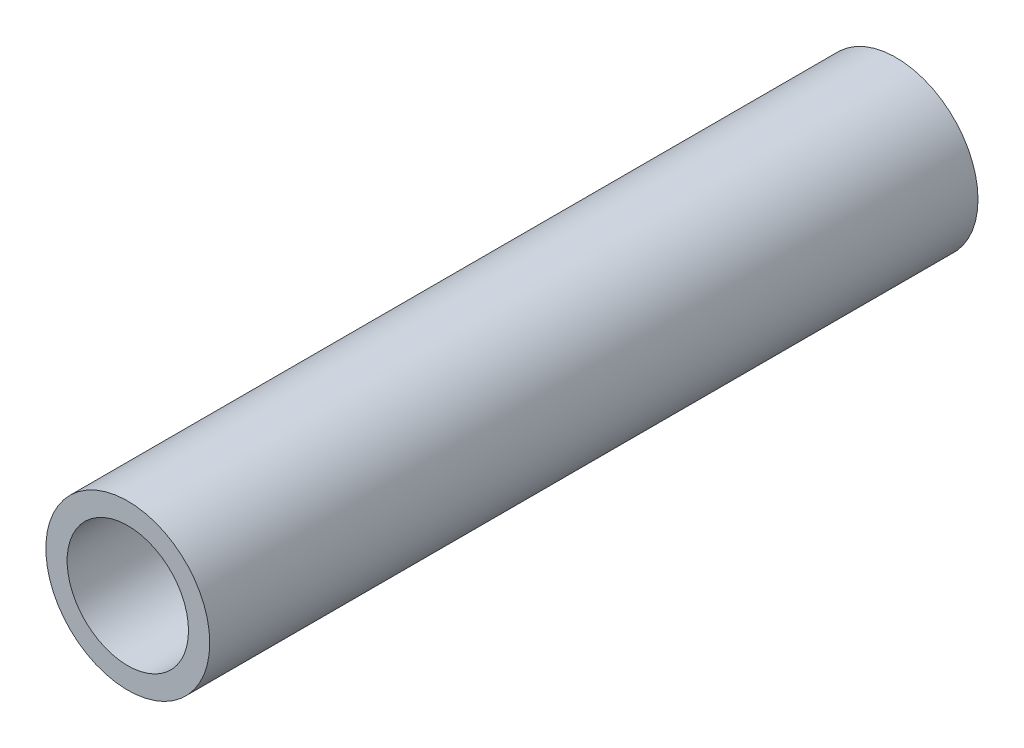
ISO-10303-21;
HEADER;
FILE_DESCRIPTION(('STEP AP214'),'2;1');
FILE_NAME('part.step','',(''),(''),'','','');
FILE_SCHEMA(('AUTOMOTIVE_DESIGN { 1 0 10303 214 1 1 1 1 }'));
ENDSEC;
DATA;
#1=APPLICATION_CONTEXT('core data for automotive mechanical design processes');
#2=APPLICATION_PROTOCOL_DEFINITION('international standard','automotive_design',2000,#1);
#3=PRODUCT_CONTEXT('',#1,'mechanical');
#4=PRODUCT('Part','Part','',(#3));
#5=PRODUCT_RELATED_PRODUCT_CATEGORY('part','',(#4));
#6=PRODUCT_DEFINITION_FORMATION('','',#4);
#7=PRODUCT_DEFINITION_CONTEXT('part definition',#1,'design');
#8=PRODUCT_DEFINITION('design','',#6,#7);
#9=PRODUCT_DEFINITION_SHAPE('','',#8);
#10=(LENGTH_UNIT() NAMED_UNIT(*) SI_UNIT(.MILLI.,.METRE.));
#11=(NAMED_UNIT(*) PLANE_ANGLE_UNIT() SI_UNIT($,.RADIAN.));
#12=(NAMED_UNIT(*) SI_UNIT($,.STERADIAN.) SOLID_ANGLE_UNIT());
#13=UNCERTAINTY_MEASURE_WITH_UNIT(LENGTH_MEASURE(1.E-05),#10,'distance_accuracy_value','');
#14=(GEOMETRIC_REPRESENTATION_CONTEXT(3) GLOBAL_UNCERTAINTY_ASSIGNED_CONTEXT((#13)) GLOBAL_UNIT_ASSIGNED_CONTEXT((#10,
#11,#12)) REPRESENTATION_CONTEXT('',''));
#15=CARTESIAN_POINT('',(0.,0.,0.));
#16=DIRECTION('',(0.,0.,1.));
#17=DIRECTION('',(1.,0.,0.));
#18=AXIS2_PLACEMENT_3D('',#15,#16,#17);
#19=CARTESIAN_POINT('',(0.,0.,50.));
#20=DIRECTION('',(0.,0.,1.));
#21=DIRECTION('',(1.,0.,0.));
#22=AXIS2_PLACEMENT_3D('',#19,#20,#21);
#23=PLANE('',#22);
#24=CARTESIAN_POINT('',(0.,0.,50.));
#25=DIRECTION('',(0.,0.,1.));
#26=DIRECTION('',(1.,0.,0.));
#27=AXIS2_PLACEMENT_3D('',#24,#25,#26);
#28=CIRCLE('',#27,10.668);
#29=CARTESIAN_POINT('',(10.668,0.,50.));
#30=VERTEX_POINT('',#29);
#31=EDGE_CURVE('E11',#30,#30,#28,.T.);
#32=ORIENTED_EDGE('',*,*,#31,.T.);
#33=EDGE_LOOP('',(#32));
#34=FACE_BOUND('',#33,.T.);
#35=CARTESIAN_POINT('',(0.,0.,50.));
#36=DIRECTION('',(0.,0.,1.));
#37=DIRECTION('',(1.,0.,0.));
#38=AXIS2_PLACEMENT_3D('',#35,#36,#37);
#39=CIRCLE('',#38,7.8994);
#40=CARTESIAN_POINT('',(7.8994,0.,50.));
#41=VERTEX_POINT('',#40);
#42=EDGE_CURVE('E56',#41,#41,#39,.T.);
#43=ORIENTED_EDGE('',*,*,#42,.F.);
#44=EDGE_LOOP('',(#43));
#45=FACE_BOUND('',#44,.T.);
#46=ADVANCED_FACE('F43',(#34,#45),#23,.T.);
#47=CARTESIAN_POINT('',(0.,0.,-50.));
#48=DIRECTION('',(0.,0.,1.));
#49=DIRECTION('',(1.,0.,0.));
#50=AXIS2_PLACEMENT_3D('',#47,#48,#49);
#51=PLANE('',#50);
#52=CARTESIAN_POINT('',(0.,0.,-50.));
#53=DIRECTION('',(0.,0.,1.));
#54=DIRECTION('',(1.,0.,0.));
#55=AXIS2_PLACEMENT_3D('',#52,#53,#54);
#56=CIRCLE('',#55,10.668);
#57=CARTESIAN_POINT('',(10.668,0.,-50.));
#58=VERTEX_POINT('',#57);
#59=EDGE_CURVE('E47',#58,#58,#56,.T.);
#60=ORIENTED_EDGE('',*,*,#59,.F.);
#61=EDGE_LOOP('',(#60));
#62=FACE_BOUND('',#61,.T.);
#63=CARTESIAN_POINT('',(0.,0.,-50.));
#64=DIRECTION('',(0.,0.,1.));
#65=DIRECTION('',(1.,0.,0.));
#66=AXIS2_PLACEMENT_3D('',#63,#64,#65);
#67=CIRCLE('',#66,7.8994);
#68=CARTESIAN_POINT('',(7.8994,0.,-50.));
#69=VERTEX_POINT('',#68);
#70=EDGE_CURVE('E58',#69,#69,#67,.T.);
#71=ORIENTED_EDGE('',*,*,#70,.T.);
#72=EDGE_LOOP('',(#71));
#73=FACE_BOUND('',#72,.T.);
#74=ADVANCED_FACE('F70',(#62,#73),#51,.F.);
#75=CARTESIAN_POINT('',(0.,0.,50.));
#76=DIRECTION('',(0.,0.,-1.));
#77=DIRECTION('',(-1.,0.,0.));
#78=AXIS2_PLACEMENT_3D('',#75,#76,#77);
#79=CYLINDRICAL_SURFACE('',#78,10.668);
#80=ORIENTED_EDGE('',*,*,#31,.F.);
#81=EDGE_LOOP('',(#80));
#82=FACE_BOUND('',#81,.T.);
#83=ORIENTED_EDGE('',*,*,#59,.T.);
#84=EDGE_LOOP('',(#83));
#85=FACE_BOUND('',#84,.T.);
#86=ADVANCED_FACE('F45',(#82,#85),#79,.T.);
#87=CARTESIAN_POINT('',(0.,0.,50.));
#88=DIRECTION('',(0.,0.,-1.));
#89=DIRECTION('',(-1.,0.,0.));
#90=AXIS2_PLACEMENT_3D('',#87,#88,#89);
#91=CYLINDRICAL_SURFACE('',#90,7.8994);
#92=ORIENTED_EDGE('',*,*,#42,.T.);
#93=EDGE_LOOP('',(#92));
#94=FACE_BOUND('',#93,.T.);
#95=ORIENTED_EDGE('',*,*,#70,.F.);
#96=EDGE_LOOP('',(#95));
#97=FACE_BOUND('',#96,.T.);
#98=ADVANCED_FACE('F66',(#94,#97),#91,.F.);
#99=CLOSED_SHELL('',(#46,#74,#86,#98));
#100=MANIFOLD_SOLID_BREP('B2',#99);
#101=ADVANCED_BREP_SHAPE_REPRESENTATION('',(#18,#100),#14);
#102=SHAPE_DEFINITION_REPRESENTATION(#9,#101);
ENDSEC;
END-ISO-10303-21;
